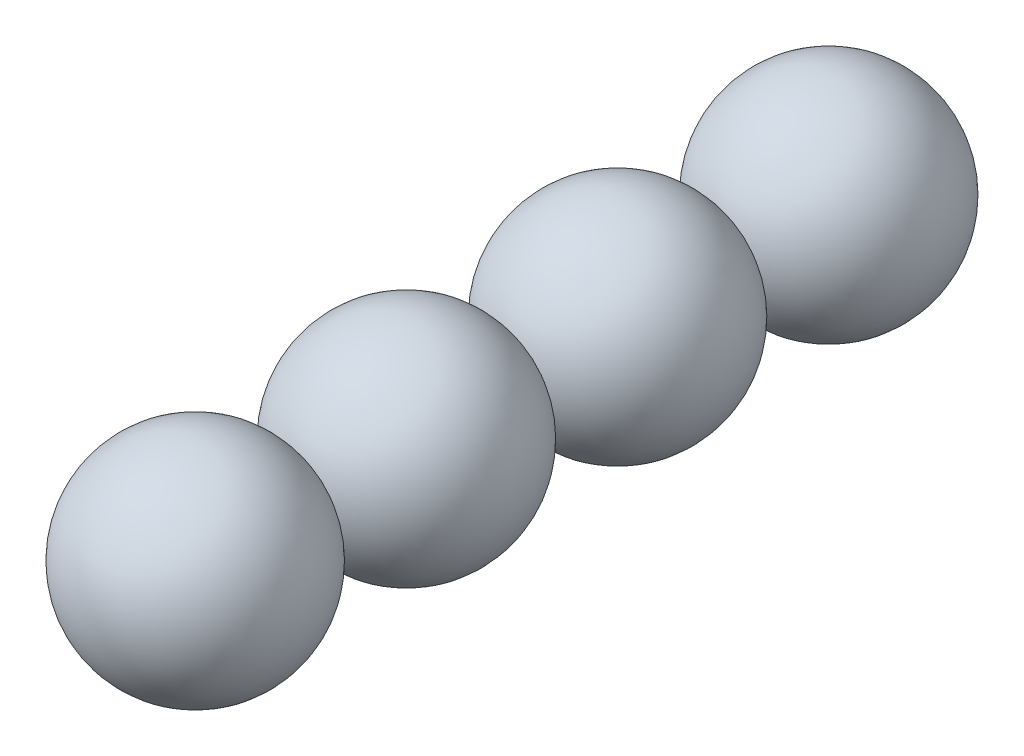
ISO-10303-21;
HEADER;
FILE_DESCRIPTION(('STEP AP214'),'2;1');
FILE_NAME('part.step','',(''),(''),'','','');
FILE_SCHEMA(('AUTOMOTIVE_DESIGN { 1 0 10303 214 1 1 1 1 }'));
ENDSEC;
DATA;
#1=APPLICATION_CONTEXT('core data for automotive mechanical design processes');
#2=APPLICATION_PROTOCOL_DEFINITION('international standard','automotive_design',2000,#1);
#3=PRODUCT_CONTEXT('',#1,'mechanical');
#4=PRODUCT('Part','Part','',(#3));
#5=PRODUCT_RELATED_PRODUCT_CATEGORY('part','',(#4));
#6=PRODUCT_DEFINITION_FORMATION('','',#4);
#7=PRODUCT_DEFINITION_CONTEXT('part definition',#1,'design');
#8=PRODUCT_DEFINITION('design','',#6,#7);
#9=PRODUCT_DEFINITION_SHAPE('','',#8);
#10=(LENGTH_UNIT() NAMED_UNIT(*) SI_UNIT(.MILLI.,.METRE.));
#11=(NAMED_UNIT(*) PLANE_ANGLE_UNIT() SI_UNIT($,.RADIAN.));
#12=(NAMED_UNIT(*) SI_UNIT($,.STERADIAN.) SOLID_ANGLE_UNIT());
#13=UNCERTAINTY_MEASURE_WITH_UNIT(LENGTH_MEASURE(1.E-05),#10,'distance_accuracy_value','');
#14=(GEOMETRIC_REPRESENTATION_CONTEXT(3) GLOBAL_UNCERTAINTY_ASSIGNED_CONTEXT((#13)) GLOBAL_UNIT_ASSIGNED_CONTEXT((#10,
#11,#12)) REPRESENTATION_CONTEXT('',''));
#15=CARTESIAN_POINT('',(0.,0.,0.));
#16=DIRECTION('',(0.,0.,1.));
#17=DIRECTION('',(1.,0.,0.));
#18=AXIS2_PLACEMENT_3D('',#15,#16,#17);
#19=CARTESIAN_POINT('',(0.,0.,180.));
#20=DIRECTION('',(0.,1.,0.));
#21=DIRECTION('',(1.,0.,0.));
#22=AXIS2_PLACEMENT_3D('',#19,#20,#21);
#23=SPHERICAL_SURFACE('',#22,30.);
#24=CARTESIAN_POINT('',(0.,30.,180.));
#25=VERTEX_POINT('',#24);
#26=VERTEX_LOOP('',#25);
#27=FACE_BOUND('',#26,.T.);
#28=ADVANCED_FACE('F41',(#27),#23,.T.);
#29=CLOSED_SHELL('',(#28));
#30=MANIFOLD_SOLID_BREP('B2',#29);
#31=CARTESIAN_POINT('',(0.,0.,120.));
#32=DIRECTION('',(0.,1.,0.));
#33=DIRECTION('',(1.,0.,0.));
#34=AXIS2_PLACEMENT_3D('',#31,#32,#33);
#35=SPHERICAL_SURFACE('',#34,30.);
#36=CARTESIAN_POINT('',(0.,30.,120.));
#37=VERTEX_POINT('',#36);
#38=VERTEX_LOOP('',#37);
#39=FACE_BOUND('',#38,.T.);
#40=ADVANCED_FACE('F59',(#39),#35,.T.);
#41=CLOSED_SHELL('',(#40));
#42=MANIFOLD_SOLID_BREP('B6',#41);
#43=CARTESIAN_POINT('',(0.,0.,60.));
#44=DIRECTION('',(0.,1.,0.));
#45=DIRECTION('',(1.,0.,0.));
#46=AXIS2_PLACEMENT_3D('',#43,#44,#45);
#47=SPHERICAL_SURFACE('',#46,30.);
#48=CARTESIAN_POINT('',(0.,30.,60.));
#49=VERTEX_POINT('',#48);
#50=VERTEX_LOOP('',#49);
#51=FACE_BOUND('',#50,.T.);
#52=ADVANCED_FACE('F76',(#51),#47,.T.);
#53=CLOSED_SHELL('',(#52));
#54=MANIFOLD_SOLID_BREP('B37',#53);
#55=CARTESIAN_POINT('',(0.,0.,0.));
#56=DIRECTION('',(0.,1.,0.));
#57=DIRECTION('',(1.,0.,0.));
#58=AXIS2_PLACEMENT_3D('',#55,#56,#57);
#59=SPHERICAL_SURFACE('',#58,30.);
#60=CARTESIAN_POINT('',(0.,30.,0.));
#61=VERTEX_POINT('',#60);
#62=VERTEX_LOOP('',#61);
#63=FACE_BOUND('',#62,.T.);
#64=ADVANCED_FACE('F88',(#63),#59,.T.);
#65=CLOSED_SHELL('',(#64));
#66=MANIFOLD_SOLID_BREP('B55',#65);
#67=ADVANCED_BREP_SHAPE_REPRESENTATION('',(#18,#30,#42,#54,#66),#14);
#68=SHAPE_DEFINITION_REPRESENTATION(#9,#67);
ENDSEC;
END-ISO-10303-21;
